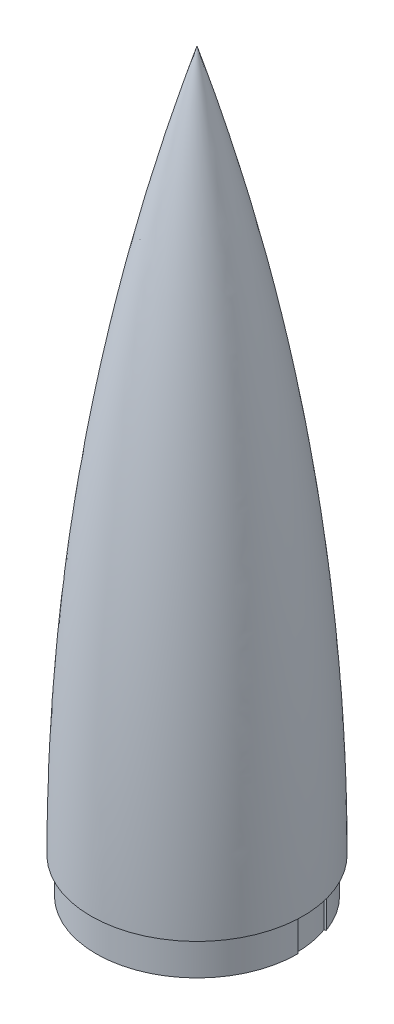
ISO-10303-21;
HEADER;
FILE_DESCRIPTION(('STEP AP214'),'2;1');
FILE_NAME('part.step','',(''),(''),'','','');
FILE_SCHEMA(('AUTOMOTIVE_DESIGN { 1 0 10303 214 1 1 1 1 }'));
ENDSEC;
DATA;
#1=APPLICATION_CONTEXT('core data for automotive mechanical design processes');
#2=APPLICATION_PROTOCOL_DEFINITION('international standard','automotive_design',2000,#1);
#3=PRODUCT_CONTEXT('',#1,'mechanical');
#4=PRODUCT('Part','Part','',(#3));
#5=PRODUCT_RELATED_PRODUCT_CATEGORY('part','',(#4));
#6=PRODUCT_DEFINITION_FORMATION('','',#4);
#7=PRODUCT_DEFINITION_CONTEXT('part definition',#1,'design');
#8=PRODUCT_DEFINITION('design','',#6,#7);
#9=PRODUCT_DEFINITION_SHAPE('','',#8);
#10=(LENGTH_UNIT() NAMED_UNIT(*) SI_UNIT(.MILLI.,.METRE.));
#11=(NAMED_UNIT(*) PLANE_ANGLE_UNIT() SI_UNIT($,.RADIAN.));
#12=(NAMED_UNIT(*) SI_UNIT($,.STERADIAN.) SOLID_ANGLE_UNIT());
#13=UNCERTAINTY_MEASURE_WITH_UNIT(LENGTH_MEASURE(1.E-05),#10,'distance_accuracy_value','');
#14=(GEOMETRIC_REPRESENTATION_CONTEXT(3) GLOBAL_UNCERTAINTY_ASSIGNED_CONTEXT((#13)) GLOBAL_UNIT_ASSIGNED_CONTEXT((#10,
#11,#12)) REPRESENTATION_CONTEXT('',''));
#15=CARTESIAN_POINT('',(0.,0.,0.));
#16=DIRECTION('',(0.,0.,1.));
#17=DIRECTION('',(1.,0.,0.));
#18=AXIS2_PLACEMENT_3D('',#15,#16,#17);
#19=CARTESIAN_POINT('',(0.,20.,0.));
#20=DIRECTION('',(0.,-1.,0.));
#21=DIRECTION('',(0.,0.,-1.));
#22=AXIS2_PLACEMENT_3D('',#19,#20,#21);
#23=CYLINDRICAL_SURFACE('',#22,57.);
#24=CARTESIAN_POINT('',(0.,0.,0.));
#25=DIRECTION('',(0.,1.,0.));
#26=DIRECTION('',(0.,0.,1.));
#27=AXIS2_PLACEMENT_3D('',#24,#25,#26);
#28=CIRCLE('',#27,57.);
#29=CARTESIAN_POINT('',(53.5624793847968,0.,-19.4951481695632));
#30=VERTEX_POINT('',#29);
#31=CARTESIAN_POINT('',(-57.,0.,0.));
#32=VERTEX_POINT('',#31);
#33=EDGE_CURVE('E167',#30,#32,#28,.T.);
#34=ORIENTED_EDGE('',*,*,#33,.T.);
#35=DIRECTION('',(0.,1.,0.));
#36=VECTOR('',#35,1.);
#37=CARTESIAN_POINT('',(-57.,0.,0.));
#38=LINE('',#37,#36);
#39=CARTESIAN_POINT('',(-57.,20.,0.));
#40=VERTEX_POINT('',#39);
#41=EDGE_CURVE('E136',#32,#40,#38,.T.);
#42=ORIENTED_EDGE('',*,*,#41,.T.);
#43=CARTESIAN_POINT('',(0.,20.,0.));
#44=DIRECTION('',(0.,1.,0.));
#45=DIRECTION('',(0.,0.,1.));
#46=AXIS2_PLACEMENT_3D('',#43,#44,#45);
#47=CIRCLE('',#46,57.);
#48=CARTESIAN_POINT('',(53.5624793847968,20.,-19.4951481695632));
#49=VERTEX_POINT('',#48);
#50=EDGE_CURVE('E11',#49,#40,#47,.T.);
#51=ORIENTED_EDGE('',*,*,#50,.F.);
#52=DIRECTION('',(0.,1.,0.));
#53=VECTOR('',#52,1.);
#54=CARTESIAN_POINT('',(53.5624793847968,0.,-19.4951481695632));
#55=LINE('',#54,#53);
#56=EDGE_CURVE('E153',#30,#49,#55,.T.);
#57=ORIENTED_EDGE('',*,*,#56,.F.);
#58=EDGE_LOOP('',(#34,#42,#51,#57));
#59=FACE_BOUND('',#58,.T.);
#60=ADVANCED_FACE('F35',(#59),#23,.T.);
#61=CARTESIAN_POINT('',(-53.5624793847969,20.,19.4951481695628));
#62=VERTEX_POINT('',#61);
#63=CARTESIAN_POINT('',(57.,20.,0.));
#64=VERTEX_POINT('',#63);
#65=EDGE_CURVE('E44',#62,#64,#47,.T.);
#66=ORIENTED_EDGE('',*,*,#65,.F.);
#67=DIRECTION('',(0.,1.,0.));
#68=VECTOR('',#67,1.);
#69=CARTESIAN_POINT('',(-53.5624793847969,0.,19.4951481695628));
#70=LINE('',#69,#68);
#71=CARTESIAN_POINT('',(-53.5624793847969,0.,19.4951481695628));
#72=VERTEX_POINT('',#71);
#73=EDGE_CURVE('E126',#72,#62,#70,.T.);
#74=ORIENTED_EDGE('',*,*,#73,.F.);
#75=CARTESIAN_POINT('',(57.,0.,0.));
#76=VERTEX_POINT('',#75);
#77=EDGE_CURVE('E39',#72,#76,#28,.T.);
#78=ORIENTED_EDGE('',*,*,#77,.T.);
#79=DIRECTION('',(0.,1.,0.));
#80=VECTOR('',#79,1.);
#81=CARTESIAN_POINT('',(57.,0.,0.));
#82=LINE('',#81,#80);
#83=EDGE_CURVE('E131',#76,#64,#82,.T.);
#84=ORIENTED_EDGE('',*,*,#83,.T.);
#85=EDGE_LOOP('',(#66,#74,#78,#84));
#86=FACE_BOUND('',#85,.T.);
#87=ADVANCED_FACE('F37',(#86),#23,.T.);
#88=CARTESIAN_POINT('',(0.,0.,0.));
#89=DIRECTION('',(0.,1.,0.));
#90=DIRECTION('',(0.,0.,1.));
#91=AXIS2_PLACEMENT_3D('',#88,#89,#90);
#92=PLANE('',#91);
#93=CARTESIAN_POINT('',(0.,0.,0.));
#94=DIRECTION('',(0.,-1.,0.));
#95=DIRECTION('',(0.,0.,1.));
#96=AXIS2_PLACEMENT_3D('',#93,#94,#95);
#97=CIRCLE('',#96,56.);
#98=CARTESIAN_POINT('',(-52.622786764011,0.,19.1531280262371));
#99=VERTEX_POINT('',#98);
#100=CARTESIAN_POINT('',(-56.,0.,0.));
#101=VERTEX_POINT('',#100);
#102=EDGE_CURVE('E51',#99,#101,#97,.T.);
#103=ORIENTED_EDGE('',*,*,#102,.T.);
#104=DIRECTION('',(-1.,0.,0.));
#105=VECTOR('',#104,1.);
#106=CARTESIAN_POINT('',(-57.,0.,0.));
#107=LINE('',#106,#105);
#108=EDGE_CURVE('E123',#101,#32,#107,.T.);
#109=ORIENTED_EDGE('',*,*,#108,.T.);
#110=ORIENTED_EDGE('',*,*,#33,.F.);
#111=DIRECTION('',(-0.939692620785908,0.,0.342020143325669));
#112=VECTOR('',#111,1.);
#113=CARTESIAN_POINT('',(52.6227867640109,0.,-19.1531280262375));
#114=LINE('',#113,#112);
#115=CARTESIAN_POINT('',(52.6227867640108,0.,-19.1531280262375));
#116=VERTEX_POINT('',#115);
#117=EDGE_CURVE('E146',#30,#116,#114,.T.);
#118=ORIENTED_EDGE('',*,*,#117,.T.);
#119=CARTESIAN_POINT('',(0.,0.,0.));
#120=DIRECTION('',(0.,-1.,0.));
#121=DIRECTION('',(0.,0.,1.));
#122=AXIS2_PLACEMENT_3D('',#119,#120,#121);
#123=CIRCLE('',#122,56.);
#124=CARTESIAN_POINT('',(56.,0.,0.));
#125=VERTEX_POINT('',#124);
#126=EDGE_CURVE('E59',#116,#125,#123,.T.);
#127=ORIENTED_EDGE('',*,*,#126,.T.);
#128=DIRECTION('',(1.,0.,0.));
#129=VECTOR('',#128,1.);
#130=CARTESIAN_POINT('',(56.,0.,0.));
#131=LINE('',#130,#129);
#132=EDGE_CURVE('E151',#125,#76,#131,.T.);
#133=ORIENTED_EDGE('',*,*,#132,.T.);
#134=ORIENTED_EDGE('',*,*,#77,.F.);
#135=DIRECTION('',(0.939692620785911,0.,-0.342020143325661));
#136=VECTOR('',#135,1.);
#137=CARTESIAN_POINT('',(-52.622786764011,0.,19.1531280262371));
#138=LINE('',#137,#136);
#139=EDGE_CURVE('E118',#72,#99,#138,.T.);
#140=ORIENTED_EDGE('',*,*,#139,.T.);
#141=EDGE_LOOP('',(#103,#109,#110,#118,#127,#133,#134,#140));
#142=FACE_BOUND('',#141,.T.);
#143=ADVANCED_FACE('F179',(#142),#92,.F.);
#144=CARTESIAN_POINT('',(56.,0.,0.));
#145=DIRECTION('',(0.,0.,1.));
#146=DIRECTION('',(1.,0.,0.));
#147=AXIS2_PLACEMENT_3D('',#144,#145,#146);
#148=PLANE('',#147);
#149=DIRECTION('',(1.,0.,0.));
#150=VECTOR('',#149,1.);
#151=CARTESIAN_POINT('',(56.,20.,0.));
#152=LINE('',#151,#150);
#153=CARTESIAN_POINT('',(56.,20.,0.));
#154=VERTEX_POINT('',#153);
#155=EDGE_CURVE('E149',#154,#64,#152,.T.);
#156=ORIENTED_EDGE('',*,*,#155,.T.);
#157=ORIENTED_EDGE('',*,*,#83,.F.);
#158=ORIENTED_EDGE('',*,*,#132,.F.);
#159=DIRECTION('',(0.,1.,0.));
#160=VECTOR('',#159,1.);
#161=CARTESIAN_POINT('',(56.,0.,0.));
#162=LINE('',#161,#160);
#163=EDGE_CURVE('E161',#125,#154,#162,.T.);
#164=ORIENTED_EDGE('',*,*,#163,.T.);
#165=EDGE_LOOP('',(#156,#157,#158,#164));
#166=FACE_BOUND('',#165,.T.);
#167=ADVANCED_FACE('F182',(#166),#148,.F.);
#168=CARTESIAN_POINT('',(0.,0.,0.));
#169=DIRECTION('',(0.,1.,0.));
#170=DIRECTION('',(0.,0.,1.));
#171=AXIS2_PLACEMENT_3D('',#168,#169,#170);
#172=CYLINDRICAL_SURFACE('',#171,56.);
#173=CARTESIAN_POINT('',(0.,20.,0.));
#174=DIRECTION('',(0.,-1.,0.));
#175=DIRECTION('',(0.,0.,1.));
#176=AXIS2_PLACEMENT_3D('',#173,#174,#175);
#177=CIRCLE('',#176,56.);
#178=CARTESIAN_POINT('',(52.6227867640108,20.,-19.1531280262375));
#179=VERTEX_POINT('',#178);
#180=EDGE_CURVE('E115',#179,#154,#177,.T.);
#181=ORIENTED_EDGE('',*,*,#180,.T.);
#182=ORIENTED_EDGE('',*,*,#163,.F.);
#183=ORIENTED_EDGE('',*,*,#126,.F.);
#184=DIRECTION('',(0.,1.,0.));
#185=VECTOR('',#184,1.);
#186=CARTESIAN_POINT('',(52.6227867640108,0.,-19.1531280262375));
#187=LINE('',#186,#185);
#188=EDGE_CURVE('E164',#116,#179,#187,.T.);
#189=ORIENTED_EDGE('',*,*,#188,.T.);
#190=EDGE_LOOP('',(#181,#182,#183,#189));
#191=FACE_BOUND('',#190,.T.);
#192=ADVANCED_FACE('F183',(#191),#172,.T.);
#193=CARTESIAN_POINT('',(52.6227867640109,0.,-19.1531280262375));
#194=DIRECTION('',(-0.342020143325669,0.,-0.939692620785908));
#195=DIRECTION('',(-0.939692620785909,0.,0.342020143325669));
#196=AXIS2_PLACEMENT_3D('',#193,#194,#195);
#197=PLANE('',#196);
#198=DIRECTION('',(-0.939692620785908,0.,0.342020143325669));
#199=VECTOR('',#198,1.);
#200=CARTESIAN_POINT('',(52.6227867640109,20.,-19.1531280262375));
#201=LINE('',#200,#199);
#202=EDGE_CURVE('E112',#49,#179,#201,.T.);
#203=ORIENTED_EDGE('',*,*,#202,.T.);
#204=ORIENTED_EDGE('',*,*,#188,.F.);
#205=ORIENTED_EDGE('',*,*,#117,.F.);
#206=ORIENTED_EDGE('',*,*,#56,.T.);
#207=EDGE_LOOP('',(#203,#204,#205,#206));
#208=FACE_BOUND('',#207,.T.);
#209=ADVANCED_FACE('F185',(#208),#197,.F.);
#210=CARTESIAN_POINT('',(-57.,0.,0.));
#211=DIRECTION('',(0.,0.,-1.));
#212=DIRECTION('',(-1.,0.,0.));
#213=AXIS2_PLACEMENT_3D('',#210,#211,#212);
#214=PLANE('',#213);
#215=DIRECTION('',(-1.,0.,0.));
#216=VECTOR('',#215,1.);
#217=CARTESIAN_POINT('',(-57.,20.,0.));
#218=LINE('',#217,#216);
#219=CARTESIAN_POINT('',(-56.,20.,0.));
#220=VERTEX_POINT('',#219);
#221=EDGE_CURVE('E121',#220,#40,#218,.T.);
#222=ORIENTED_EDGE('',*,*,#221,.T.);
#223=ORIENTED_EDGE('',*,*,#41,.F.);
#224=ORIENTED_EDGE('',*,*,#108,.F.);
#225=DIRECTION('',(0.,1.,0.));
#226=VECTOR('',#225,1.);
#227=CARTESIAN_POINT('',(-56.,0.,0.));
#228=LINE('',#227,#226);
#229=EDGE_CURVE('E139',#101,#220,#228,.T.);
#230=ORIENTED_EDGE('',*,*,#229,.T.);
#231=EDGE_LOOP('',(#222,#223,#224,#230));
#232=FACE_BOUND('',#231,.T.);
#233=ADVANCED_FACE('F188',(#232),#214,.F.);
#234=CARTESIAN_POINT('',(0.,0.,0.));
#235=DIRECTION('',(0.,1.,0.));
#236=DIRECTION('',(0.,0.,1.));
#237=AXIS2_PLACEMENT_3D('',#234,#235,#236);
#238=CYLINDRICAL_SURFACE('',#237,56.);
#239=CARTESIAN_POINT('',(0.,20.,0.));
#240=DIRECTION('',(0.,-1.,0.));
#241=DIRECTION('',(0.,0.,1.));
#242=AXIS2_PLACEMENT_3D('',#239,#240,#241);
#243=CIRCLE('',#242,56.);
#244=CARTESIAN_POINT('',(-52.622786764011,20.,19.1531280262371));
#245=VERTEX_POINT('',#244);
#246=EDGE_CURVE('E130',#245,#220,#243,.T.);
#247=ORIENTED_EDGE('',*,*,#246,.T.);
#248=ORIENTED_EDGE('',*,*,#229,.F.);
#249=ORIENTED_EDGE('',*,*,#102,.F.);
#250=DIRECTION('',(0.,1.,0.));
#251=VECTOR('',#250,1.);
#252=CARTESIAN_POINT('',(-52.622786764011,0.,19.1531280262371));
#253=LINE('',#252,#251);
#254=EDGE_CURVE('E142',#99,#245,#253,.T.);
#255=ORIENTED_EDGE('',*,*,#254,.T.);
#256=EDGE_LOOP('',(#247,#248,#249,#255));
#257=FACE_BOUND('',#256,.T.);
#258=ADVANCED_FACE('F190',(#257),#238,.T.);
#259=CARTESIAN_POINT('',(-52.622786764011,0.,19.1531280262371));
#260=DIRECTION('',(0.342020143325661,0.,0.939692620785911));
#261=DIRECTION('',(0.939692620785911,0.,-0.342020143325661));
#262=AXIS2_PLACEMENT_3D('',#259,#260,#261);
#263=PLANE('',#262);
#264=DIRECTION('',(0.939692620785911,0.,-0.342020143325661));
#265=VECTOR('',#264,1.);
#266=CARTESIAN_POINT('',(-52.622786764011,20.,19.1531280262371));
#267=LINE('',#266,#265);
#268=EDGE_CURVE('E127',#62,#245,#267,.T.);
#269=ORIENTED_EDGE('',*,*,#268,.T.);
#270=ORIENTED_EDGE('',*,*,#254,.F.);
#271=ORIENTED_EDGE('',*,*,#139,.F.);
#272=ORIENTED_EDGE('',*,*,#73,.T.);
#273=EDGE_LOOP('',(#269,#270,#271,#272));
#274=FACE_BOUND('',#273,.T.);
#275=ADVANCED_FACE('F192',(#274),#263,.F.);
#276=CARTESIAN_POINT('',(0.,20.,0.));
#277=DIRECTION('',(0.,1.,0.));
#278=DIRECTION('',(0.,0.,1.));
#279=AXIS2_PLACEMENT_3D('',#276,#277,#278);
#280=PLANE('',#279);
#281=CARTESIAN_POINT('',(0.,20.,0.));
#282=DIRECTION('',(0.,1.,0.));
#283=DIRECTION('',(0.,0.,1.));
#284=AXIS2_PLACEMENT_3D('',#281,#282,#283);
#285=CIRCLE('',#284,60.);
#286=CARTESIAN_POINT('',(0.,20.,60.));
#287=VERTEX_POINT('',#286);
#288=EDGE_CURVE('E110',#287,#287,#285,.T.);
#289=ORIENTED_EDGE('',*,*,#288,.F.);
#290=EDGE_LOOP('',(#289));
#291=FACE_BOUND('',#290,.T.);
#292=ORIENTED_EDGE('',*,*,#65,.T.);
#293=ORIENTED_EDGE('',*,*,#155,.F.);
#294=ORIENTED_EDGE('',*,*,#180,.F.);
#295=ORIENTED_EDGE('',*,*,#202,.F.);
#296=ORIENTED_EDGE('',*,*,#50,.T.);
#297=ORIENTED_EDGE('',*,*,#221,.F.);
#298=ORIENTED_EDGE('',*,*,#246,.F.);
#299=ORIENTED_EDGE('',*,*,#268,.F.);
#300=EDGE_LOOP('',(#292,#293,#294,#295,#296,#297,#298,#299));
#301=FACE_BOUND('',#300,.T.);
#302=ADVANCED_FACE('F106',(#291,#301),#280,.F.);
#303=CARTESIAN_POINT('',(0.,20.,-1276.26110572015));
#304=DIRECTION('',(-1.,0.,0.));
#305=DIRECTION('',(0.,0.,1.));
#306=AXIS2_PLACEMENT_3D('',#303,#304,#305);
#307=CIRCLE('',#306,1336.26110572015);
#308=TRIMMED_CURVE('',#307,(PARAMETER_VALUE(-0.300803953809159)),
(PARAMETER_VALUE(0.300803953809159)),.T.,.PARAMETER.);
#309=CARTESIAN_POINT('',(0.,20.,0.));
#310=DIRECTION('',(0.,1.,0.));
#311=AXIS1_PLACEMENT('',#309,#310);
#312=SURFACE_OF_REVOLUTION('',#308,#311);
#313=CARTESIAN_POINT('',(0.,415.918340932088,0.));
#314=VERTEX_POINT('',#313);
#315=VERTEX_LOOP('',#314);
#316=FACE_BOUND('',#315,.T.);
#317=ORIENTED_EDGE('',*,*,#288,.T.);
#318=EDGE_LOOP('',(#317));
#319=FACE_BOUND('',#318,.T.);
#320=ADVANCED_FACE('F103',(#316,#319),#312,.T.);
#321=CLOSED_SHELL('',(#60,#87,#143,#167,#192,#209,#233,#258,#275,#302,#320));
#322=MANIFOLD_SOLID_BREP('B2',#321);
#323=ADVANCED_BREP_SHAPE_REPRESENTATION('',(#18,#322),#14);
#324=SHAPE_DEFINITION_REPRESENTATION(#9,#323);
ENDSEC;
END-ISO-10303-21;
